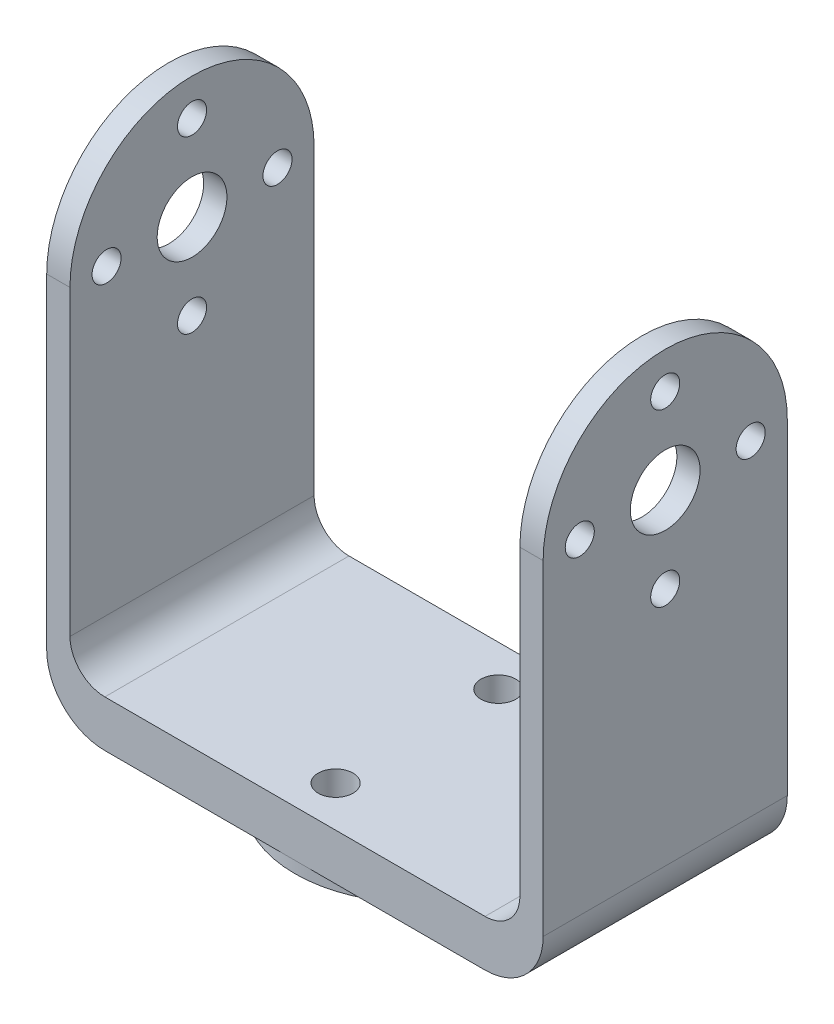
ISO-10303-21;
HEADER;
FILE_DESCRIPTION(('STEP AP214'),'2;1');
FILE_NAME('part.step','',(''),(''),'','','');
FILE_SCHEMA(('AUTOMOTIVE_DESIGN { 1 0 10303 214 1 1 1 1 }'));
ENDSEC;
DATA;
#1=APPLICATION_CONTEXT('core data for automotive mechanical design processes');
#2=APPLICATION_PROTOCOL_DEFINITION('international standard','automotive_design',2000,#1);
#3=PRODUCT_CONTEXT('',#1,'mechanical');
#4=PRODUCT('Part','Part','',(#3));
#5=PRODUCT_RELATED_PRODUCT_CATEGORY('part','',(#4));
#6=PRODUCT_DEFINITION_FORMATION('','',#4);
#7=PRODUCT_DEFINITION_CONTEXT('part definition',#1,'design');
#8=PRODUCT_DEFINITION('design','',#6,#7);
#9=PRODUCT_DEFINITION_SHAPE('','',#8);
#10=(LENGTH_UNIT() NAMED_UNIT(*) SI_UNIT(.MILLI.,.METRE.));
#11=(NAMED_UNIT(*) PLANE_ANGLE_UNIT() SI_UNIT($,.RADIAN.));
#12=(NAMED_UNIT(*) SI_UNIT($,.STERADIAN.) SOLID_ANGLE_UNIT());
#13=UNCERTAINTY_MEASURE_WITH_UNIT(LENGTH_MEASURE(1.E-05),#10,'distance_accuracy_value','');
#14=(GEOMETRIC_REPRESENTATION_CONTEXT(3) GLOBAL_UNCERTAINTY_ASSIGNED_CONTEXT((#13)) GLOBAL_UNIT_ASSIGNED_CONTEXT((#10,
#11,#12)) REPRESENTATION_CONTEXT('',''));
#15=CARTESIAN_POINT('',(0.,0.,0.));
#16=DIRECTION('',(0.,0.,1.));
#17=DIRECTION('',(1.,0.,0.));
#18=AXIS2_PLACEMENT_3D('',#15,#16,#17);
#19=CARTESIAN_POINT('',(0.,-1.,0.));
#20=DIRECTION('',(0.,-1.,0.));
#21=DIRECTION('',(0.,0.,-1.));
#22=AXIS2_PLACEMENT_3D('',#19,#20,#21);
#23=PLANE('',#22);
#24=DIRECTION('',(1.,0.,0.));
#25=VECTOR('',#24,1.);
#26=CARTESIAN_POINT('',(-21.35,-1.,-10.5));
#27=LINE('',#26,#25);
#28=CARTESIAN_POINT('',(0.,-1.,-10.5));
#29=VERTEX_POINT('',#28);
#30=CARTESIAN_POINT('',(16.35,-1.,-10.5));
#31=VERTEX_POINT('',#30);
#32=EDGE_CURVE('E136',#29,#31,#27,.T.);
#33=ORIENTED_EDGE('',*,*,#32,.T.);
#34=DIRECTION('',(0.,0.,1.));
#35=VECTOR('',#34,1.);
#36=CARTESIAN_POINT('',(16.35,-1.,10.5));
#37=LINE('',#36,#35);
#38=CARTESIAN_POINT('',(16.35,-1.,10.5));
#39=VERTEX_POINT('',#38);
#40=EDGE_CURVE('E287',#31,#39,#37,.T.);
#41=ORIENTED_EDGE('',*,*,#40,.T.);
#42=DIRECTION('',(-1.,0.,0.));
#43=VECTOR('',#42,1.);
#44=CARTESIAN_POINT('',(-21.35,-1.,10.5));
#45=LINE('',#44,#43);
#46=CARTESIAN_POINT('',(0.,-1.,10.5));
#47=VERTEX_POINT('',#46);
#48=EDGE_CURVE('E151',#39,#47,#45,.T.);
#49=ORIENTED_EDGE('',*,*,#48,.T.);
#50=CARTESIAN_POINT('',(0.,-1.,0.));
#51=DIRECTION('',(0.,-1.,0.));
#52=DIRECTION('',(0.,0.,-1.));
#53=AXIS2_PLACEMENT_3D('',#50,#51,#52);
#54=CIRCLE('',#53,10.5);
#55=EDGE_CURVE('E149',#29,#47,#54,.T.);
#56=ORIENTED_EDGE('',*,*,#55,.F.);
#57=EDGE_LOOP('',(#33,#41,#49,#56));
#58=FACE_BOUND('',#57,.T.);
#59=ADVANCED_FACE('F35',(#58),#23,.T.);
#60=CARTESIAN_POINT('',(-19.35,32.,0.));
#61=DIRECTION('',(1.,0.,0.));
#62=DIRECTION('',(0.,0.,-1.));
#63=AXIS2_PLACEMENT_3D('',#60,#61,#62);
#64=PLANE('',#63);
#65=CARTESIAN_POINT('',(-19.35,32.,0.));
#66=DIRECTION('',(-1.,0.,0.));
#67=DIRECTION('',(0.,0.,1.));
#68=AXIS2_PLACEMENT_3D('',#65,#66,#67);
#69=CIRCLE('',#68,3.);
#70=CARTESIAN_POINT('',(-19.35,32.,3.));
#71=VERTEX_POINT('',#70);
#72=EDGE_CURVE('E220',#71,#71,#69,.T.);
#73=ORIENTED_EDGE('',*,*,#72,.T.);
#74=EDGE_LOOP('',(#73));
#75=FACE_BOUND('',#74,.T.);
#76=CARTESIAN_POINT('',(-19.35,32.,7.35));
#77=DIRECTION('',(-1.,0.,0.));
#78=DIRECTION('',(0.,0.,1.));
#79=AXIS2_PLACEMENT_3D('',#76,#77,#78);
#80=CIRCLE('',#79,1.25);
#81=CARTESIAN_POINT('',(-19.35,32.,8.6));
#82=VERTEX_POINT('',#81);
#83=EDGE_CURVE('E226',#82,#82,#80,.T.);
#84=ORIENTED_EDGE('',*,*,#83,.T.);
#85=EDGE_LOOP('',(#84));
#86=FACE_BOUND('',#85,.T.);
#87=CARTESIAN_POINT('',(-19.35,39.35,0.));
#88=DIRECTION('',(-1.,0.,0.));
#89=DIRECTION('',(0.,0.,1.));
#90=AXIS2_PLACEMENT_3D('',#87,#88,#89);
#91=CIRCLE('',#90,1.25);
#92=CARTESIAN_POINT('',(-19.35,39.35,1.25));
#93=VERTEX_POINT('',#92);
#94=EDGE_CURVE('E232',#93,#93,#91,.T.);
#95=ORIENTED_EDGE('',*,*,#94,.T.);
#96=EDGE_LOOP('',(#95));
#97=FACE_BOUND('',#96,.T.);
#98=CARTESIAN_POINT('',(-19.35,32.,-7.35));
#99=DIRECTION('',(-1.,0.,0.));
#100=DIRECTION('',(0.,0.,1.));
#101=AXIS2_PLACEMENT_3D('',#98,#99,#100);
#102=CIRCLE('',#101,1.25);
#103=CARTESIAN_POINT('',(-19.35,32.,-6.1));
#104=VERTEX_POINT('',#103);
#105=EDGE_CURVE('E238',#104,#104,#102,.T.);
#106=ORIENTED_EDGE('',*,*,#105,.T.);
#107=EDGE_LOOP('',(#106));
#108=FACE_BOUND('',#107,.T.);
#109=CARTESIAN_POINT('',(-19.35,24.65,0.));
#110=DIRECTION('',(-1.,0.,0.));
#111=DIRECTION('',(0.,0.,1.));
#112=AXIS2_PLACEMENT_3D('',#109,#110,#111);
#113=CIRCLE('',#112,1.25);
#114=CARTESIAN_POINT('',(-19.35,24.65,1.25000000000001));
#115=VERTEX_POINT('',#114);
#116=EDGE_CURVE('E244',#115,#115,#113,.T.);
#117=ORIENTED_EDGE('',*,*,#116,.T.);
#118=EDGE_LOOP('',(#117));
#119=FACE_BOUND('',#118,.T.);
#120=DIRECTION('',(0.,1.,0.));
#121=VECTOR('',#120,1.);
#122=CARTESIAN_POINT('',(-19.35,2.,10.5));
#123=LINE('',#122,#121);
#124=CARTESIAN_POINT('',(-19.35,6.,10.5));
#125=VERTEX_POINT('',#124);
#126=CARTESIAN_POINT('',(-19.35,32.,10.5));
#127=VERTEX_POINT('',#126);
#128=EDGE_CURVE('E250',#125,#127,#123,.T.);
#129=ORIENTED_EDGE('',*,*,#128,.F.);
#130=DIRECTION('',(0.,0.,-1.));
#131=VECTOR('',#130,1.);
#132=CARTESIAN_POINT('',(-19.35,6.,0.));
#133=LINE('',#132,#131);
#134=CARTESIAN_POINT('',(-19.35,6.,-10.5));
#135=VERTEX_POINT('',#134);
#136=EDGE_CURVE('E276',#125,#135,#133,.T.);
#137=ORIENTED_EDGE('',*,*,#136,.T.);
#138=DIRECTION('',(0.,-1.,0.));
#139=VECTOR('',#138,1.);
#140=CARTESIAN_POINT('',(-19.35,2.,-10.5));
#141=LINE('',#140,#139);
#142=CARTESIAN_POINT('',(-19.35,32.,-10.5));
#143=VERTEX_POINT('',#142);
#144=EDGE_CURVE('E255',#143,#135,#141,.T.);
#145=ORIENTED_EDGE('',*,*,#144,.F.);
#146=CARTESIAN_POINT('',(-19.35,32.,0.));
#147=DIRECTION('',(-1.,0.,0.));
#148=DIRECTION('',(0.,0.,-1.));
#149=AXIS2_PLACEMENT_3D('',#146,#147,#148);
#150=CIRCLE('',#149,10.5);
#151=EDGE_CURVE('E252',#127,#143,#150,.T.);
#152=ORIENTED_EDGE('',*,*,#151,.F.);
#153=EDGE_LOOP('',(#129,#137,#145,#152));
#154=FACE_BOUND('',#153,.T.);
#155=ADVANCED_FACE('F320',(#75,#86,#97,#108,#119,#154),#64,.T.);
#156=CARTESIAN_POINT('',(19.35,32.,0.));
#157=DIRECTION('',(-1.,0.,0.));
#158=DIRECTION('',(0.,0.,-1.));
#159=AXIS2_PLACEMENT_3D('',#156,#157,#158);
#160=PLANE('',#159);
#161=CARTESIAN_POINT('',(19.35,32.,7.35));
#162=DIRECTION('',(-1.,0.,0.));
#163=DIRECTION('',(0.,0.,1.));
#164=AXIS2_PLACEMENT_3D('',#161,#162,#163);
#165=CIRCLE('',#164,1.25);
#166=CARTESIAN_POINT('',(19.35,32.,8.6));
#167=VERTEX_POINT('',#166);
#168=EDGE_CURVE('E180',#167,#167,#165,.T.);
#169=ORIENTED_EDGE('',*,*,#168,.F.);
#170=EDGE_LOOP('',(#169));
#171=FACE_BOUND('',#170,.T.);
#172=CARTESIAN_POINT('',(19.35,32.,-7.35));
#173=DIRECTION('',(-1.,0.,0.));
#174=DIRECTION('',(0.,0.,1.));
#175=AXIS2_PLACEMENT_3D('',#172,#173,#174);
#176=CIRCLE('',#175,1.25);
#177=CARTESIAN_POINT('',(19.35,32.,-6.1));
#178=VERTEX_POINT('',#177);
#179=EDGE_CURVE('E192',#178,#178,#176,.T.);
#180=ORIENTED_EDGE('',*,*,#179,.F.);
#181=EDGE_LOOP('',(#180));
#182=FACE_BOUND('',#181,.T.);
#183=CARTESIAN_POINT('',(19.35,24.65,0.));
#184=DIRECTION('',(-1.,0.,0.));
#185=DIRECTION('',(0.,0.,1.));
#186=AXIS2_PLACEMENT_3D('',#183,#184,#185);
#187=CIRCLE('',#186,1.25);
#188=CARTESIAN_POINT('',(19.35,24.65,1.25000000000001));
#189=VERTEX_POINT('',#188);
#190=EDGE_CURVE('E198',#189,#189,#187,.T.);
#191=ORIENTED_EDGE('',*,*,#190,.F.);
#192=EDGE_LOOP('',(#191));
#193=FACE_BOUND('',#192,.T.);
#194=CARTESIAN_POINT('',(19.35,39.35,0.));
#195=DIRECTION('',(-1.,0.,0.));
#196=DIRECTION('',(0.,0.,1.));
#197=AXIS2_PLACEMENT_3D('',#194,#195,#196);
#198=CIRCLE('',#197,1.25);
#199=CARTESIAN_POINT('',(19.35,39.35,1.25));
#200=VERTEX_POINT('',#199);
#201=EDGE_CURVE('E186',#200,#200,#198,.T.);
#202=ORIENTED_EDGE('',*,*,#201,.F.);
#203=EDGE_LOOP('',(#202));
#204=FACE_BOUND('',#203,.T.);
#205=CARTESIAN_POINT('',(19.35,32.,0.));
#206=DIRECTION('',(-1.,0.,0.));
#207=DIRECTION('',(0.,0.,1.));
#208=AXIS2_PLACEMENT_3D('',#205,#206,#207);
#209=CIRCLE('',#208,3.);
#210=CARTESIAN_POINT('',(19.35,32.,3.));
#211=VERTEX_POINT('',#210);
#212=EDGE_CURVE('E174',#211,#211,#209,.T.);
#213=ORIENTED_EDGE('',*,*,#212,.F.);
#214=EDGE_LOOP('',(#213));
#215=FACE_BOUND('',#214,.T.);
#216=DIRECTION('',(0.,-1.,0.));
#217=VECTOR('',#216,1.);
#218=CARTESIAN_POINT('',(19.35,2.,-10.5));
#219=LINE('',#218,#217);
#220=CARTESIAN_POINT('',(19.35,32.,-10.5));
#221=VERTEX_POINT('',#220);
#222=CARTESIAN_POINT('',(19.35,6.,-10.5));
#223=VERTEX_POINT('',#222);
#224=EDGE_CURVE('E204',#221,#223,#219,.T.);
#225=ORIENTED_EDGE('',*,*,#224,.T.);
#226=DIRECTION('',(0.,0.,1.));
#227=VECTOR('',#226,1.);
#228=CARTESIAN_POINT('',(19.35,6.,0.));
#229=LINE('',#228,#227);
#230=CARTESIAN_POINT('',(19.35,6.,10.5));
#231=VERTEX_POINT('',#230);
#232=EDGE_CURVE('E156',#223,#231,#229,.T.);
#233=ORIENTED_EDGE('',*,*,#232,.T.);
#234=DIRECTION('',(0.,1.,0.));
#235=VECTOR('',#234,1.);
#236=CARTESIAN_POINT('',(19.35,2.,10.5));
#237=LINE('',#236,#235);
#238=CARTESIAN_POINT('',(19.35,32.,10.5));
#239=VERTEX_POINT('',#238);
#240=EDGE_CURVE('E209',#231,#239,#237,.T.);
#241=ORIENTED_EDGE('',*,*,#240,.T.);
#242=CARTESIAN_POINT('',(19.35,32.,0.));
#243=DIRECTION('',(-1.,0.,0.));
#244=DIRECTION('',(0.,0.,-1.));
#245=AXIS2_PLACEMENT_3D('',#242,#243,#244);
#246=CIRCLE('',#245,10.5);
#247=EDGE_CURVE('E207',#239,#221,#246,.T.);
#248=ORIENTED_EDGE('',*,*,#247,.T.);
#249=EDGE_LOOP('',(#225,#233,#241,#248));
#250=FACE_BOUND('',#249,.T.);
#251=ADVANCED_FACE('F337',(#171,#182,#193,#204,#215,#250),#160,.T.);
#252=CARTESIAN_POINT('',(21.35,2.,-10.5));
#253=DIRECTION('',(-1.,0.,0.));
#254=DIRECTION('',(0.,0.,1.));
#255=AXIS2_PLACEMENT_3D('',#252,#253,#254);
#256=PLANE('',#255);
#257=DIRECTION('',(0.,-1.,0.));
#258=VECTOR('',#257,1.);
#259=CARTESIAN_POINT('',(21.35,2.,10.5));
#260=LINE('',#259,#258);
#261=CARTESIAN_POINT('',(21.35,32.,10.5));
#262=VERTEX_POINT('',#261);
#263=CARTESIAN_POINT('',(21.35,4.,10.5));
#264=VERTEX_POINT('',#263);
#265=EDGE_CURVE('E264',#262,#264,#260,.T.);
#266=ORIENTED_EDGE('',*,*,#265,.T.);
#267=DIRECTION('',(0.,0.,1.));
#268=VECTOR('',#267,1.);
#269=CARTESIAN_POINT('',(21.35,4.,-10.5));
#270=LINE('',#269,#268);
#271=CARTESIAN_POINT('',(21.35,4.,-10.5));
#272=VERTEX_POINT('',#271);
#273=EDGE_CURVE('E293',#264,#272,#270,.F.);
#274=ORIENTED_EDGE('',*,*,#273,.T.);
#275=DIRECTION('',(0.,-1.,0.));
#276=VECTOR('',#275,1.);
#277=CARTESIAN_POINT('',(21.35,2.,-10.5));
#278=LINE('',#277,#276);
#279=CARTESIAN_POINT('',(21.35,32.,-10.5));
#280=VERTEX_POINT('',#279);
#281=EDGE_CURVE('E157',#280,#272,#278,.T.);
#282=ORIENTED_EDGE('',*,*,#281,.F.);
#283=CARTESIAN_POINT('',(21.35,32.,0.));
#284=DIRECTION('',(-1.,0.,0.));
#285=DIRECTION('',(0.,0.,-1.));
#286=AXIS2_PLACEMENT_3D('',#283,#284,#285);
#287=CIRCLE('',#286,10.5);
#288=EDGE_CURVE('E201',#262,#280,#287,.T.);
#289=ORIENTED_EDGE('',*,*,#288,.F.);
#290=EDGE_LOOP('',(#266,#274,#282,#289));
#291=FACE_BOUND('',#290,.T.);
#292=CARTESIAN_POINT('',(21.35,32.,0.));
#293=DIRECTION('',(-1.,0.,0.));
#294=DIRECTION('',(0.,0.,1.));
#295=AXIS2_PLACEMENT_3D('',#292,#293,#294);
#296=CIRCLE('',#295,3.);
#297=CARTESIAN_POINT('',(21.35,32.,3.));
#298=VERTEX_POINT('',#297);
#299=EDGE_CURVE('E173',#298,#298,#296,.T.);
#300=ORIENTED_EDGE('',*,*,#299,.T.);
#301=EDGE_LOOP('',(#300));
#302=FACE_BOUND('',#301,.T.);
#303=CARTESIAN_POINT('',(21.35,32.,7.35));
#304=DIRECTION('',(-1.,0.,0.));
#305=DIRECTION('',(0.,0.,1.));
#306=AXIS2_PLACEMENT_3D('',#303,#304,#305);
#307=CIRCLE('',#306,1.25);
#308=CARTESIAN_POINT('',(21.35,32.,8.6));
#309=VERTEX_POINT('',#308);
#310=EDGE_CURVE('E177',#309,#309,#307,.T.);
#311=ORIENTED_EDGE('',*,*,#310,.T.);
#312=EDGE_LOOP('',(#311));
#313=FACE_BOUND('',#312,.T.);
#314=CARTESIAN_POINT('',(21.35,39.35,0.));
#315=DIRECTION('',(-1.,0.,0.));
#316=DIRECTION('',(0.,0.,1.));
#317=AXIS2_PLACEMENT_3D('',#314,#315,#316);
#318=CIRCLE('',#317,1.25);
#319=CARTESIAN_POINT('',(21.35,39.35,1.25000000000001));
#320=VERTEX_POINT('',#319);
#321=EDGE_CURVE('E183',#320,#320,#318,.T.);
#322=ORIENTED_EDGE('',*,*,#321,.T.);
#323=EDGE_LOOP('',(#322));
#324=FACE_BOUND('',#323,.T.);
#325=CARTESIAN_POINT('',(21.35,32.,-7.35));
#326=DIRECTION('',(-1.,0.,0.));
#327=DIRECTION('',(0.,0.,1.));
#328=AXIS2_PLACEMENT_3D('',#325,#326,#327);
#329=CIRCLE('',#328,1.25);
#330=CARTESIAN_POINT('',(21.35,32.,-6.1));
#331=VERTEX_POINT('',#330);
#332=EDGE_CURVE('E189',#331,#331,#329,.T.);
#333=ORIENTED_EDGE('',*,*,#332,.T.);
#334=EDGE_LOOP('',(#333));
#335=FACE_BOUND('',#334,.T.);
#336=CARTESIAN_POINT('',(21.35,24.65,0.));
#337=DIRECTION('',(-1.,0.,0.));
#338=DIRECTION('',(0.,0.,1.));
#339=AXIS2_PLACEMENT_3D('',#336,#337,#338);
#340=CIRCLE('',#339,1.25);
#341=CARTESIAN_POINT('',(21.35,24.65,1.25000000000001));
#342=VERTEX_POINT('',#341);
#343=EDGE_CURVE('E195',#342,#342,#340,.T.);
#344=ORIENTED_EDGE('',*,*,#343,.T.);
#345=EDGE_LOOP('',(#344));
#346=FACE_BOUND('',#345,.T.);
#347=ADVANCED_FACE('F298',(#291,#302,#313,#324,#335,#346),#256,.F.);
#348=CARTESIAN_POINT('',(-21.35,2.,-10.5));
#349=DIRECTION('',(0.,0.,1.));
#350=DIRECTION('',(1.,0.,0.));
#351=AXIS2_PLACEMENT_3D('',#348,#349,#350);
#352=PLANE('',#351);
#353=ORIENTED_EDGE('',*,*,#281,.T.);
#354=CARTESIAN_POINT('',(16.35,4.,-10.5));
#355=DIRECTION('',(0.,0.,1.));
#356=DIRECTION('',(1.,0.,0.));
#357=AXIS2_PLACEMENT_3D('',#354,#355,#356);
#358=CIRCLE('',#357,5.);
#359=EDGE_CURVE('E143',#272,#31,#358,.F.);
#360=ORIENTED_EDGE('',*,*,#359,.T.);
#361=ORIENTED_EDGE('',*,*,#32,.F.);
#362=CARTESIAN_POINT('',(-16.35,-1.,-10.5));
#363=VERTEX_POINT('',#362);
#364=EDGE_CURVE('E128',#363,#29,#27,.T.);
#365=ORIENTED_EDGE('',*,*,#364,.F.);
#366=CARTESIAN_POINT('',(-16.35,4.,-10.5));
#367=DIRECTION('',(0.,0.,1.));
#368=DIRECTION('',(1.,0.,0.));
#369=AXIS2_PLACEMENT_3D('',#366,#367,#368);
#370=CIRCLE('',#369,5.);
#371=CARTESIAN_POINT('',(-21.35,4.,-10.5));
#372=VERTEX_POINT('',#371);
#373=EDGE_CURVE('E50',#363,#372,#370,.F.);
#374=ORIENTED_EDGE('',*,*,#373,.T.);
#375=DIRECTION('',(0.,-1.,0.));
#376=VECTOR('',#375,1.);
#377=CARTESIAN_POINT('',(-21.35,2.,-10.5));
#378=LINE('',#377,#376);
#379=CARTESIAN_POINT('',(-21.35,32.,-10.5));
#380=VERTEX_POINT('',#379);
#381=EDGE_CURVE('E161',#380,#372,#378,.T.);
#382=ORIENTED_EDGE('',*,*,#381,.F.);
#383=DIRECTION('',(-1.,0.,0.));
#384=VECTOR('',#383,1.);
#385=CARTESIAN_POINT('',(-19.35,32.,-10.5));
#386=LINE('',#385,#384);
#387=EDGE_CURVE('E261',#143,#380,#386,.T.);
#388=ORIENTED_EDGE('',*,*,#387,.F.);
#389=ORIENTED_EDGE('',*,*,#144,.T.);
#390=CARTESIAN_POINT('',(-16.35,6.,-10.5));
#391=DIRECTION('',(0.,0.,1.));
#392=DIRECTION('',(1.,0.,0.));
#393=AXIS2_PLACEMENT_3D('',#390,#391,#392);
#394=CIRCLE('',#393,3.);
#395=CARTESIAN_POINT('',(-16.35,3.,-10.5));
#396=VERTEX_POINT('',#395);
#397=EDGE_CURVE('E283',#135,#396,#394,.T.);
#398=ORIENTED_EDGE('',*,*,#397,.T.);
#399=DIRECTION('',(1.,0.,0.));
#400=VECTOR('',#399,1.);
#401=CARTESIAN_POINT('',(-21.35,3.,-10.5));
#402=LINE('',#401,#400);
#403=CARTESIAN_POINT('',(16.35,3.,-10.5));
#404=VERTEX_POINT('',#403);
#405=EDGE_CURVE('E167',#396,#404,#402,.T.);
#406=ORIENTED_EDGE('',*,*,#405,.T.);
#407=CARTESIAN_POINT('',(16.35,6.,-10.5));
#408=DIRECTION('',(0.,0.,1.));
#409=DIRECTION('',(1.,0.,0.));
#410=AXIS2_PLACEMENT_3D('',#407,#408,#409);
#411=CIRCLE('',#410,3.);
#412=EDGE_CURVE('E281',#404,#223,#411,.T.);
#413=ORIENTED_EDGE('',*,*,#412,.T.);
#414=ORIENTED_EDGE('',*,*,#224,.F.);
#415=DIRECTION('',(1.,0.,0.));
#416=VECTOR('',#415,1.);
#417=CARTESIAN_POINT('',(19.35,32.,-10.5));
#418=LINE('',#417,#416);
#419=EDGE_CURVE('E211',#221,#280,#418,.T.);
#420=ORIENTED_EDGE('',*,*,#419,.T.);
#421=EDGE_LOOP('',(#353,#360,#361,#365,#374,#382,#388,#389,#398,#406,#413,#414,#420));
#422=FACE_BOUND('',#421,.T.);
#423=ADVANCED_FACE('F141',(#422),#352,.F.);
#424=CARTESIAN_POINT('',(-21.35,2.,-10.5));
#425=DIRECTION('',(1.,0.,0.));
#426=DIRECTION('',(0.,0.,-1.));
#427=AXIS2_PLACEMENT_3D('',#424,#425,#426);
#428=PLANE('',#427);
#429=ORIENTED_EDGE('',*,*,#381,.T.);
#430=DIRECTION('',(0.,0.,-1.));
#431=VECTOR('',#430,1.);
#432=CARTESIAN_POINT('',(-21.35,4.,10.5));
#433=LINE('',#432,#431);
#434=CARTESIAN_POINT('',(-21.35,4.,10.5));
#435=VERTEX_POINT('',#434);
#436=EDGE_CURVE('E11',#372,#435,#433,.F.);
#437=ORIENTED_EDGE('',*,*,#436,.T.);
#438=DIRECTION('',(0.,-1.,0.));
#439=VECTOR('',#438,1.);
#440=CARTESIAN_POINT('',(-21.35,2.,10.5));
#441=LINE('',#440,#439);
#442=CARTESIAN_POINT('',(-21.35,32.,10.5));
#443=VERTEX_POINT('',#442);
#444=EDGE_CURVE('E269',#443,#435,#441,.T.);
#445=ORIENTED_EDGE('',*,*,#444,.F.);
#446=CARTESIAN_POINT('',(-21.35,32.,0.));
#447=DIRECTION('',(-1.,0.,0.));
#448=DIRECTION('',(0.,0.,-1.));
#449=AXIS2_PLACEMENT_3D('',#446,#447,#448);
#450=CIRCLE('',#449,10.5);
#451=EDGE_CURVE('E247',#443,#380,#450,.T.);
#452=ORIENTED_EDGE('',*,*,#451,.T.);
#453=EDGE_LOOP('',(#429,#437,#445,#452));
#454=FACE_BOUND('',#453,.T.);
#455=CARTESIAN_POINT('',(-21.35,24.65,0.));
#456=DIRECTION('',(-1.,0.,0.));
#457=DIRECTION('',(0.,0.,1.));
#458=AXIS2_PLACEMENT_3D('',#455,#456,#457);
#459=CIRCLE('',#458,1.25);
#460=CARTESIAN_POINT('',(-21.35,24.65,1.25000000000001));
#461=VERTEX_POINT('',#460);
#462=EDGE_CURVE('E241',#461,#461,#459,.T.);
#463=ORIENTED_EDGE('',*,*,#462,.F.);
#464=EDGE_LOOP('',(#463));
#465=FACE_BOUND('',#464,.T.);
#466=CARTESIAN_POINT('',(-21.35,32.,-7.35));
#467=DIRECTION('',(-1.,0.,0.));
#468=DIRECTION('',(0.,0.,1.));
#469=AXIS2_PLACEMENT_3D('',#466,#467,#468);
#470=CIRCLE('',#469,1.25);
#471=CARTESIAN_POINT('',(-21.35,32.,-6.1));
#472=VERTEX_POINT('',#471);
#473=EDGE_CURVE('E235',#472,#472,#470,.T.);
#474=ORIENTED_EDGE('',*,*,#473,.F.);
#475=EDGE_LOOP('',(#474));
#476=FACE_BOUND('',#475,.T.);
#477=CARTESIAN_POINT('',(-21.35,39.35,0.));
#478=DIRECTION('',(-1.,0.,0.));
#479=DIRECTION('',(0.,0.,1.));
#480=AXIS2_PLACEMENT_3D('',#477,#478,#479);
#481=CIRCLE('',#480,1.25);
#482=CARTESIAN_POINT('',(-21.35,39.35,1.25000000000001));
#483=VERTEX_POINT('',#482);
#484=EDGE_CURVE('E229',#483,#483,#481,.T.);
#485=ORIENTED_EDGE('',*,*,#484,.F.);
#486=EDGE_LOOP('',(#485));
#487=FACE_BOUND('',#486,.T.);
#488=CARTESIAN_POINT('',(-21.35,32.,7.35));
#489=DIRECTION('',(-1.,0.,0.));
#490=DIRECTION('',(0.,0.,1.));
#491=AXIS2_PLACEMENT_3D('',#488,#489,#490);
#492=CIRCLE('',#491,1.25);
#493=CARTESIAN_POINT('',(-21.35,32.,8.6));
#494=VERTEX_POINT('',#493);
#495=EDGE_CURVE('E223',#494,#494,#492,.T.);
#496=ORIENTED_EDGE('',*,*,#495,.F.);
#497=EDGE_LOOP('',(#496));
#498=FACE_BOUND('',#497,.T.);
#499=CARTESIAN_POINT('',(-21.35,32.,0.));
#500=DIRECTION('',(-1.,0.,0.));
#501=DIRECTION('',(0.,0.,1.));
#502=AXIS2_PLACEMENT_3D('',#499,#500,#501);
#503=CIRCLE('',#502,3.);
#504=CARTESIAN_POINT('',(-21.35,32.,3.));
#505=VERTEX_POINT('',#504);
#506=EDGE_CURVE('E217',#505,#505,#503,.T.);
#507=ORIENTED_EDGE('',*,*,#506,.F.);
#508=EDGE_LOOP('',(#507));
#509=FACE_BOUND('',#508,.T.);
#510=ADVANCED_FACE('F309',(#454,#465,#476,#487,#498,#509),#428,.F.);
#511=CARTESIAN_POINT('',(-21.35,2.,10.5));
#512=DIRECTION('',(0.,0.,-1.));
#513=DIRECTION('',(-1.,0.,0.));
#514=AXIS2_PLACEMENT_3D('',#511,#512,#513);
#515=PLANE('',#514);
#516=ORIENTED_EDGE('',*,*,#48,.F.);
#517=CARTESIAN_POINT('',(16.35,4.,10.5));
#518=DIRECTION('',(0.,0.,-1.));
#519=DIRECTION('',(-1.,0.,0.));
#520=AXIS2_PLACEMENT_3D('',#517,#518,#519);
#521=CIRCLE('',#520,5.);
#522=EDGE_CURVE('E291',#39,#264,#521,.F.);
#523=ORIENTED_EDGE('',*,*,#522,.T.);
#524=ORIENTED_EDGE('',*,*,#265,.F.);
#525=DIRECTION('',(1.,0.,0.));
#526=VECTOR('',#525,1.);
#527=CARTESIAN_POINT('',(19.35,32.,10.5));
#528=LINE('',#527,#526);
#529=EDGE_CURVE('E214',#239,#262,#528,.T.);
#530=ORIENTED_EDGE('',*,*,#529,.F.);
#531=ORIENTED_EDGE('',*,*,#240,.F.);
#532=CARTESIAN_POINT('',(16.35,6.,10.5));
#533=DIRECTION('',(0.,0.,-1.));
#534=DIRECTION('',(-1.,0.,0.));
#535=AXIS2_PLACEMENT_3D('',#532,#533,#534);
#536=CIRCLE('',#535,3.);
#537=CARTESIAN_POINT('',(16.35,3.,10.5));
#538=VERTEX_POINT('',#537);
#539=EDGE_CURVE('E279',#231,#538,#536,.T.);
#540=ORIENTED_EDGE('',*,*,#539,.T.);
#541=DIRECTION('',(-1.,0.,0.));
#542=VECTOR('',#541,1.);
#543=CARTESIAN_POINT('',(-21.35,3.,10.5));
#544=LINE('',#543,#542);
#545=CARTESIAN_POINT('',(-16.35,3.,10.5));
#546=VERTEX_POINT('',#545);
#547=EDGE_CURVE('E170',#538,#546,#544,.T.);
#548=ORIENTED_EDGE('',*,*,#547,.T.);
#549=CARTESIAN_POINT('',(-16.35,6.,10.5));
#550=DIRECTION('',(0.,0.,-1.));
#551=DIRECTION('',(-1.,0.,0.));
#552=AXIS2_PLACEMENT_3D('',#549,#550,#551);
#553=CIRCLE('',#552,3.);
#554=EDGE_CURVE('E285',#546,#125,#553,.T.);
#555=ORIENTED_EDGE('',*,*,#554,.T.);
#556=ORIENTED_EDGE('',*,*,#128,.T.);
#557=DIRECTION('',(-1.,0.,0.));
#558=VECTOR('',#557,1.);
#559=CARTESIAN_POINT('',(-19.35,32.,10.5));
#560=LINE('',#559,#558);
#561=EDGE_CURVE('E258',#127,#443,#560,.T.);
#562=ORIENTED_EDGE('',*,*,#561,.T.);
#563=ORIENTED_EDGE('',*,*,#444,.T.);
#564=CARTESIAN_POINT('',(-16.35,4.,10.5));
#565=DIRECTION('',(0.,0.,-1.));
#566=DIRECTION('',(-1.,0.,0.));
#567=AXIS2_PLACEMENT_3D('',#564,#565,#566);
#568=CIRCLE('',#567,5.);
#569=CARTESIAN_POINT('',(-16.35,-1.,10.5));
#570=VERTEX_POINT('',#569);
#571=EDGE_CURVE('E289',#435,#570,#568,.F.);
#572=ORIENTED_EDGE('',*,*,#571,.T.);
#573=EDGE_CURVE('E135',#47,#570,#45,.T.);
#574=ORIENTED_EDGE('',*,*,#573,.F.);
#575=EDGE_LOOP('',(#516,#523,#524,#530,#531,#540,#548,#555,#556,#562,#563,#572,#574));
#576=FACE_BOUND('',#575,.T.);
#577=ADVANCED_FACE('F306',(#576),#515,.F.);
#578=CARTESIAN_POINT('',(-19.35,32.,0.));
#579=DIRECTION('',(-1.,0.,0.));
#580=DIRECTION('',(0.,0.,1.));
#581=AXIS2_PLACEMENT_3D('',#578,#579,#580);
#582=CYLINDRICAL_SURFACE('',#581,10.5);
#583=ORIENTED_EDGE('',*,*,#451,.F.);
#584=ORIENTED_EDGE('',*,*,#561,.F.);
#585=ORIENTED_EDGE('',*,*,#151,.T.);
#586=ORIENTED_EDGE('',*,*,#387,.T.);
#587=EDGE_LOOP('',(#583,#584,#585,#586));
#588=FACE_BOUND('',#587,.T.);
#589=ADVANCED_FACE('F316',(#588),#582,.T.);
#590=CARTESIAN_POINT('',(-19.35,24.65,0.));
#591=DIRECTION('',(-1.,0.,0.));
#592=DIRECTION('',(0.,0.,1.));
#593=AXIS2_PLACEMENT_3D('',#590,#591,#592);
#594=CYLINDRICAL_SURFACE('',#593,1.25);
#595=ORIENTED_EDGE('',*,*,#116,.F.);
#596=EDGE_LOOP('',(#595));
#597=FACE_BOUND('',#596,.T.);
#598=ORIENTED_EDGE('',*,*,#462,.T.);
#599=EDGE_LOOP('',(#598));
#600=FACE_BOUND('',#599,.T.);
#601=ADVANCED_FACE('F523',(#597,#600),#594,.F.);
#602=CARTESIAN_POINT('',(-19.35,32.,-7.35));
#603=DIRECTION('',(-1.,0.,0.));
#604=DIRECTION('',(0.,0.,1.));
#605=AXIS2_PLACEMENT_3D('',#602,#603,#604);
#606=CYLINDRICAL_SURFACE('',#605,1.25);
#607=ORIENTED_EDGE('',*,*,#105,.F.);
#608=EDGE_LOOP('',(#607));
#609=FACE_BOUND('',#608,.T.);
#610=ORIENTED_EDGE('',*,*,#473,.T.);
#611=EDGE_LOOP('',(#610));
#612=FACE_BOUND('',#611,.T.);
#613=ADVANCED_FACE('F530',(#609,#612),#606,.F.);
#614=CARTESIAN_POINT('',(-19.35,39.35,0.));
#615=DIRECTION('',(-1.,0.,0.));
#616=DIRECTION('',(0.,0.,1.));
#617=AXIS2_PLACEMENT_3D('',#614,#615,#616);
#618=CYLINDRICAL_SURFACE('',#617,1.25);
#619=ORIENTED_EDGE('',*,*,#94,.F.);
#620=EDGE_LOOP('',(#619));
#621=FACE_BOUND('',#620,.T.);
#622=ORIENTED_EDGE('',*,*,#484,.T.);
#623=EDGE_LOOP('',(#622));
#624=FACE_BOUND('',#623,.T.);
#625=ADVANCED_FACE('F538',(#621,#624),#618,.F.);
#626=CARTESIAN_POINT('',(-19.35,32.,7.35));
#627=DIRECTION('',(-1.,0.,0.));
#628=DIRECTION('',(0.,0.,1.));
#629=AXIS2_PLACEMENT_3D('',#626,#627,#628);
#630=CYLINDRICAL_SURFACE('',#629,1.25);
#631=ORIENTED_EDGE('',*,*,#83,.F.);
#632=EDGE_LOOP('',(#631));
#633=FACE_BOUND('',#632,.T.);
#634=ORIENTED_EDGE('',*,*,#495,.T.);
#635=EDGE_LOOP('',(#634));
#636=FACE_BOUND('',#635,.T.);
#637=ADVANCED_FACE('F352',(#633,#636),#630,.F.);
#638=CARTESIAN_POINT('',(-19.35,32.,0.));
#639=DIRECTION('',(-1.,0.,0.));
#640=DIRECTION('',(0.,0.,1.));
#641=AXIS2_PLACEMENT_3D('',#638,#639,#640);
#642=CYLINDRICAL_SURFACE('',#641,3.);
#643=ORIENTED_EDGE('',*,*,#72,.F.);
#644=EDGE_LOOP('',(#643));
#645=FACE_BOUND('',#644,.T.);
#646=ORIENTED_EDGE('',*,*,#506,.T.);
#647=EDGE_LOOP('',(#646));
#648=FACE_BOUND('',#647,.T.);
#649=ADVANCED_FACE('F343',(#645,#648),#642,.F.);
#650=CARTESIAN_POINT('',(19.35,32.,0.));
#651=DIRECTION('',(1.,0.,0.));
#652=DIRECTION('',(0.,0.,-1.));
#653=AXIS2_PLACEMENT_3D('',#650,#651,#652);
#654=CYLINDRICAL_SURFACE('',#653,10.5);
#655=ORIENTED_EDGE('',*,*,#288,.T.);
#656=ORIENTED_EDGE('',*,*,#419,.F.);
#657=ORIENTED_EDGE('',*,*,#247,.F.);
#658=ORIENTED_EDGE('',*,*,#529,.T.);
#659=EDGE_LOOP('',(#655,#656,#657,#658));
#660=FACE_BOUND('',#659,.T.);
#661=ADVANCED_FACE('F340',(#660),#654,.T.);
#662=CARTESIAN_POINT('',(19.35,24.65,0.));
#663=DIRECTION('',(1.,0.,0.));
#664=DIRECTION('',(0.,0.,-1.));
#665=AXIS2_PLACEMENT_3D('',#662,#663,#664);
#666=CYLINDRICAL_SURFACE('',#665,1.25);
#667=ORIENTED_EDGE('',*,*,#190,.T.);
#668=EDGE_LOOP('',(#667));
#669=FACE_BOUND('',#668,.T.);
#670=ORIENTED_EDGE('',*,*,#343,.F.);
#671=EDGE_LOOP('',(#670));
#672=FACE_BOUND('',#671,.T.);
#673=ADVANCED_FACE('F342',(#669,#672),#666,.F.);
#674=CARTESIAN_POINT('',(19.35,32.,-7.35));
#675=DIRECTION('',(1.,0.,0.));
#676=DIRECTION('',(0.,0.,-1.));
#677=AXIS2_PLACEMENT_3D('',#674,#675,#676);
#678=CYLINDRICAL_SURFACE('',#677,1.25);
#679=ORIENTED_EDGE('',*,*,#179,.T.);
#680=EDGE_LOOP('',(#679));
#681=FACE_BOUND('',#680,.T.);
#682=ORIENTED_EDGE('',*,*,#332,.F.);
#683=EDGE_LOOP('',(#682));
#684=FACE_BOUND('',#683,.T.);
#685=ADVANCED_FACE('F349',(#681,#684),#678,.F.);
#686=CARTESIAN_POINT('',(19.35,39.35,0.));
#687=DIRECTION('',(1.,0.,0.));
#688=DIRECTION('',(0.,0.,-1.));
#689=AXIS2_PLACEMENT_3D('',#686,#687,#688);
#690=CYLINDRICAL_SURFACE('',#689,1.25);
#691=ORIENTED_EDGE('',*,*,#201,.T.);
#692=EDGE_LOOP('',(#691));
#693=FACE_BOUND('',#692,.T.);
#694=ORIENTED_EDGE('',*,*,#321,.F.);
#695=EDGE_LOOP('',(#694));
#696=FACE_BOUND('',#695,.T.);
#697=ADVANCED_FACE('F386',(#693,#696),#690,.F.);
#698=CARTESIAN_POINT('',(19.35,32.,7.35));
#699=DIRECTION('',(1.,0.,0.));
#700=DIRECTION('',(0.,0.,-1.));
#701=AXIS2_PLACEMENT_3D('',#698,#699,#700);
#702=CYLINDRICAL_SURFACE('',#701,1.25);
#703=ORIENTED_EDGE('',*,*,#168,.T.);
#704=EDGE_LOOP('',(#703));
#705=FACE_BOUND('',#704,.T.);
#706=ORIENTED_EDGE('',*,*,#310,.F.);
#707=EDGE_LOOP('',(#706));
#708=FACE_BOUND('',#707,.T.);
#709=ADVANCED_FACE('F378',(#705,#708),#702,.F.);
#710=CARTESIAN_POINT('',(19.35,32.,0.));
#711=DIRECTION('',(1.,0.,0.));
#712=DIRECTION('',(0.,0.,-1.));
#713=AXIS2_PLACEMENT_3D('',#710,#711,#712);
#714=CYLINDRICAL_SURFACE('',#713,3.);
#715=ORIENTED_EDGE('',*,*,#212,.T.);
#716=EDGE_LOOP('',(#715));
#717=FACE_BOUND('',#716,.T.);
#718=ORIENTED_EDGE('',*,*,#299,.F.);
#719=EDGE_LOOP('',(#718));
#720=FACE_BOUND('',#719,.T.);
#721=ADVANCED_FACE('F373',(#717,#720),#714,.F.);
#722=CARTESIAN_POINT('',(0.,3.,0.));
#723=DIRECTION('',(0.,-1.,0.));
#724=DIRECTION('',(0.,0.,-1.));
#725=AXIS2_PLACEMENT_3D('',#722,#723,#724);
#726=PLANE('',#725);
#727=CARTESIAN_POINT('',(0.,3.,7.));
#728=DIRECTION('',(0.,-1.,0.));
#729=DIRECTION('',(0.,0.,-1.));
#730=AXIS2_PLACEMENT_3D('',#727,#728,#729);
#731=CIRCLE('',#730,1.5);
#732=CARTESIAN_POINT('',(0.,3.,5.5));
#733=VERTEX_POINT('',#732);
#734=EDGE_CURVE('E630',#733,#733,#731,.F.);
#735=ORIENTED_EDGE('',*,*,#734,.F.);
#736=EDGE_LOOP('',(#735));
#737=FACE_BOUND('',#736,.T.);
#738=CARTESIAN_POINT('',(0.,3.,-7.));
#739=DIRECTION('',(0.,-1.,0.));
#740=DIRECTION('',(0.,0.,-1.));
#741=AXIS2_PLACEMENT_3D('',#738,#739,#740);
#742=CIRCLE('',#741,1.5);
#743=CARTESIAN_POINT('',(0.,3.,-8.5));
#744=VERTEX_POINT('',#743);
#745=EDGE_CURVE('E634',#744,#744,#742,.F.);
#746=ORIENTED_EDGE('',*,*,#745,.F.);
#747=EDGE_LOOP('',(#746));
#748=FACE_BOUND('',#747,.T.);
#749=ORIENTED_EDGE('',*,*,#547,.F.);
#750=DIRECTION('',(0.,0.,1.));
#751=VECTOR('',#750,1.);
#752=CARTESIAN_POINT('',(16.35,3.,0.));
#753=LINE('',#752,#751);
#754=EDGE_CURVE('E274',#538,#404,#753,.F.);
#755=ORIENTED_EDGE('',*,*,#754,.T.);
#756=ORIENTED_EDGE('',*,*,#405,.F.);
#757=DIRECTION('',(0.,0.,-1.));
#758=VECTOR('',#757,1.);
#759=CARTESIAN_POINT('',(-16.35,3.,0.));
#760=LINE('',#759,#758);
#761=EDGE_CURVE('E159',#396,#546,#760,.F.);
#762=ORIENTED_EDGE('',*,*,#761,.T.);
#763=EDGE_LOOP('',(#749,#755,#756,#762));
#764=FACE_BOUND('',#763,.T.);
#765=ADVANCED_FACE('F328',(#737,#748,#764),#726,.F.);
#766=ORIENTED_EDGE('',*,*,#573,.T.);
#767=DIRECTION('',(0.,0.,-1.));
#768=VECTOR('',#767,1.);
#769=CARTESIAN_POINT('',(-16.35,-1.,-10.5));
#770=LINE('',#769,#768);
#771=EDGE_CURVE('E43',#570,#363,#770,.T.);
#772=ORIENTED_EDGE('',*,*,#771,.T.);
#773=ORIENTED_EDGE('',*,*,#364,.T.);
#774=EDGE_CURVE('E133',#47,#29,#54,.T.);
#775=ORIENTED_EDGE('',*,*,#774,.F.);
#776=EDGE_LOOP('',(#766,#772,#773,#775));
#777=FACE_BOUND('',#776,.T.);
#778=ADVANCED_FACE('F131',(#777),#23,.T.);
#779=CARTESIAN_POINT('',(0.,-2.,0.));
#780=DIRECTION('',(0.,-1.,0.));
#781=DIRECTION('',(0.,0.,-1.));
#782=AXIS2_PLACEMENT_3D('',#779,#780,#781);
#783=PLANE('',#782);
#784=CARTESIAN_POINT('',(0.,-2.,7.));
#785=DIRECTION('',(0.,-1.,0.));
#786=DIRECTION('',(0.,0.,-1.));
#787=AXIS2_PLACEMENT_3D('',#784,#785,#786);
#788=CIRCLE('',#787,1.5);
#789=CARTESIAN_POINT('',(0.,-2.,5.5));
#790=VERTEX_POINT('',#789);
#791=EDGE_CURVE('E153',#790,#790,#788,.T.);
#792=ORIENTED_EDGE('',*,*,#791,.F.);
#793=EDGE_LOOP('',(#792));
#794=FACE_BOUND('',#793,.T.);
#795=CARTESIAN_POINT('',(0.,-2.,0.));
#796=DIRECTION('',(0.,-1.,0.));
#797=DIRECTION('',(0.,0.,-1.));
#798=AXIS2_PLACEMENT_3D('',#795,#796,#797);
#799=CIRCLE('',#798,10.5);
#800=CARTESIAN_POINT('',(0.,-2.,-10.5));
#801=VERTEX_POINT('',#800);
#802=EDGE_CURVE('E147',#801,#801,#799,.T.);
#803=ORIENTED_EDGE('',*,*,#802,.T.);
#804=EDGE_LOOP('',(#803));
#805=FACE_BOUND('',#804,.T.);
#806=CARTESIAN_POINT('',(0.,-2.,-7.));
#807=DIRECTION('',(0.,-1.,0.));
#808=DIRECTION('',(0.,0.,-1.));
#809=AXIS2_PLACEMENT_3D('',#806,#807,#808);
#810=CIRCLE('',#809,1.5);
#811=CARTESIAN_POINT('',(0.,-2.,-8.5));
#812=VERTEX_POINT('',#811);
#813=EDGE_CURVE('E629',#812,#812,#810,.T.);
#814=ORIENTED_EDGE('',*,*,#813,.F.);
#815=EDGE_LOOP('',(#814));
#816=FACE_BOUND('',#815,.T.);
#817=ADVANCED_FACE('F366',(#794,#805,#816),#783,.T.);
#818=CARTESIAN_POINT('',(0.,-2.,0.));
#819=DIRECTION('',(0.,1.,0.));
#820=DIRECTION('',(0.,0.,1.));
#821=AXIS2_PLACEMENT_3D('',#818,#819,#820);
#822=CYLINDRICAL_SURFACE('',#821,10.5);
#823=ORIENTED_EDGE('',*,*,#802,.F.);
#824=EDGE_LOOP('',(#823));
#825=FACE_BOUND('',#824,.T.);
#826=ORIENTED_EDGE('',*,*,#55,.T.);
#827=ORIENTED_EDGE('',*,*,#774,.T.);
#828=EDGE_LOOP('',(#826,#827));
#829=FACE_BOUND('',#828,.T.);
#830=ADVANCED_FACE('F155',(#825,#829),#822,.T.);
#831=CARTESIAN_POINT('',(0.,-2.,7.));
#832=DIRECTION('',(0.,1.,0.));
#833=DIRECTION('',(0.,0.,1.));
#834=AXIS2_PLACEMENT_3D('',#831,#832,#833);
#835=CYLINDRICAL_SURFACE('',#834,1.5);
#836=ORIENTED_EDGE('',*,*,#791,.T.);
#837=EDGE_LOOP('',(#836));
#838=FACE_BOUND('',#837,.T.);
#839=ORIENTED_EDGE('',*,*,#734,.T.);
#840=EDGE_LOOP('',(#839));
#841=FACE_BOUND('',#840,.T.);
#842=ADVANCED_FACE('F452',(#838,#841),#835,.F.);
#843=CARTESIAN_POINT('',(0.,-2.,-7.));
#844=DIRECTION('',(0.,1.,0.));
#845=DIRECTION('',(0.,0.,1.));
#846=AXIS2_PLACEMENT_3D('',#843,#844,#845);
#847=CYLINDRICAL_SURFACE('',#846,1.5);
#848=ORIENTED_EDGE('',*,*,#813,.T.);
#849=EDGE_LOOP('',(#848));
#850=FACE_BOUND('',#849,.T.);
#851=ORIENTED_EDGE('',*,*,#745,.T.);
#852=EDGE_LOOP('',(#851));
#853=FACE_BOUND('',#852,.T.);
#854=ADVANCED_FACE('F430',(#850,#853),#847,.F.);
#855=CARTESIAN_POINT('',(16.35,6.,0.));
#856=DIRECTION('',(0.,0.,1.));
#857=DIRECTION('',(1.,0.,0.));
#858=AXIS2_PLACEMENT_3D('',#855,#856,#857);
#859=CYLINDRICAL_SURFACE('',#858,3.);
#860=ORIENTED_EDGE('',*,*,#412,.F.);
#861=ORIENTED_EDGE('',*,*,#754,.F.);
#862=ORIENTED_EDGE('',*,*,#539,.F.);
#863=ORIENTED_EDGE('',*,*,#232,.F.);
#864=EDGE_LOOP('',(#860,#861,#862,#863));
#865=FACE_BOUND('',#864,.T.);
#866=ADVANCED_FACE('F335',(#865),#859,.F.);
#867=CARTESIAN_POINT('',(-16.35,6.,0.));
#868=DIRECTION('',(0.,0.,-1.));
#869=DIRECTION('',(-1.,0.,0.));
#870=AXIS2_PLACEMENT_3D('',#867,#868,#869);
#871=CYLINDRICAL_SURFACE('',#870,3.);
#872=ORIENTED_EDGE('',*,*,#554,.F.);
#873=ORIENTED_EDGE('',*,*,#761,.F.);
#874=ORIENTED_EDGE('',*,*,#397,.F.);
#875=ORIENTED_EDGE('',*,*,#136,.F.);
#876=EDGE_LOOP('',(#872,#873,#874,#875));
#877=FACE_BOUND('',#876,.T.);
#878=ADVANCED_FACE('F324',(#877),#871,.F.);
#879=CARTESIAN_POINT('',(16.35,4.,0.));
#880=DIRECTION('',(0.,0.,-1.));
#881=DIRECTION('',(-1.,0.,0.));
#882=AXIS2_PLACEMENT_3D('',#879,#880,#881);
#883=CYLINDRICAL_SURFACE('',#882,5.);
#884=ORIENTED_EDGE('',*,*,#359,.F.);
#885=ORIENTED_EDGE('',*,*,#273,.F.);
#886=ORIENTED_EDGE('',*,*,#522,.F.);
#887=ORIENTED_EDGE('',*,*,#40,.F.);
#888=EDGE_LOOP('',(#884,#885,#886,#887));
#889=FACE_BOUND('',#888,.T.);
#890=ADVANCED_FACE('F304',(#889),#883,.T.);
#891=CARTESIAN_POINT('',(-16.35,4.,0.));
#892=DIRECTION('',(0.,0.,1.));
#893=DIRECTION('',(1.,0.,0.));
#894=AXIS2_PLACEMENT_3D('',#891,#892,#893);
#895=CYLINDRICAL_SURFACE('',#894,5.);
#896=ORIENTED_EDGE('',*,*,#571,.F.);
#897=ORIENTED_EDGE('',*,*,#436,.F.);
#898=ORIENTED_EDGE('',*,*,#373,.F.);
#899=ORIENTED_EDGE('',*,*,#771,.F.);
#900=EDGE_LOOP('',(#896,#897,#898,#899));
#901=FACE_BOUND('',#900,.T.);
#902=ADVANCED_FACE('F37',(#901),#895,.T.);
#903=CLOSED_SHELL('',(#59,#155,#251,#347,#423,#510,#577,#589,#601,#613,#625,#637,#649,#661,#673,
#685,#697,#709,#721,#765,#778,#817,#830,#842,#854,#866,#878,#890,#902));
#904=MANIFOLD_SOLID_BREP('B2',#903);
#905=ADVANCED_BREP_SHAPE_REPRESENTATION('',(#18,#904),#14);
#906=SHAPE_DEFINITION_REPRESENTATION(#9,#905);
ENDSEC;
END-ISO-10303-21;
